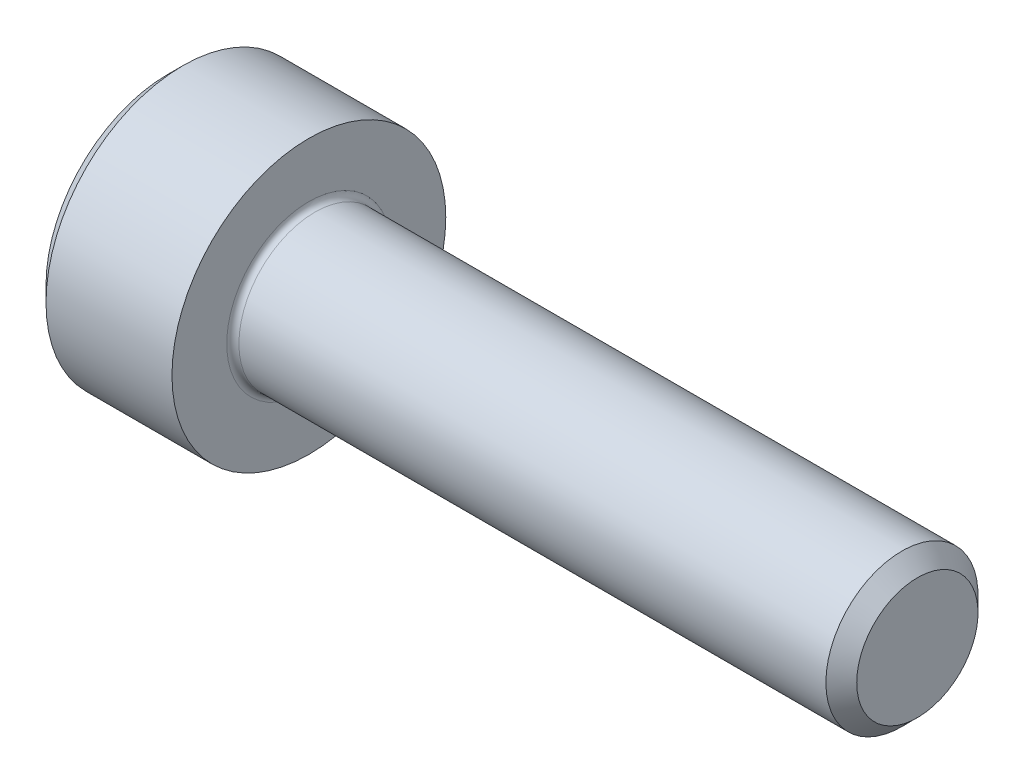
ISO-10303-21;
HEADER;
FILE_DESCRIPTION(('STEP AP214'),'2;1');
FILE_NAME('part.step','',(''),(''),'','','');
FILE_SCHEMA(('AUTOMOTIVE_DESIGN { 1 0 10303 214 1 1 1 1 }'));
ENDSEC;
DATA;
#1=APPLICATION_CONTEXT('core data for automotive mechanical design processes');
#2=APPLICATION_PROTOCOL_DEFINITION('international standard','automotive_design',2000,#1);
#3=PRODUCT_CONTEXT('',#1,'mechanical');
#4=PRODUCT('Part','Part','',(#3));
#5=PRODUCT_RELATED_PRODUCT_CATEGORY('part','',(#4));
#6=PRODUCT_DEFINITION_FORMATION('','',#4);
#7=PRODUCT_DEFINITION_CONTEXT('part definition',#1,'design');
#8=PRODUCT_DEFINITION('design','',#6,#7);
#9=PRODUCT_DEFINITION_SHAPE('','',#8);
#10=(LENGTH_UNIT() NAMED_UNIT(*) SI_UNIT(.MILLI.,.METRE.));
#11=(NAMED_UNIT(*) PLANE_ANGLE_UNIT() SI_UNIT($,.RADIAN.));
#12=(NAMED_UNIT(*) SI_UNIT($,.STERADIAN.) SOLID_ANGLE_UNIT());
#13=UNCERTAINTY_MEASURE_WITH_UNIT(LENGTH_MEASURE(1.E-05),#10,'distance_accuracy_value','');
#14=(GEOMETRIC_REPRESENTATION_CONTEXT(3) GLOBAL_UNCERTAINTY_ASSIGNED_CONTEXT((#13)) GLOBAL_UNIT_ASSIGNED_CONTEXT((#10,
#11,#12)) REPRESENTATION_CONTEXT('',''));
#15=CARTESIAN_POINT('',(0.,0.,0.));
#16=DIRECTION('',(0.,0.,1.));
#17=DIRECTION('',(1.,0.,0.));
#18=AXIS2_PLACEMENT_3D('',#15,#16,#17);
#19=CARTESIAN_POINT('',(0.,0.,0.));
#20=DIRECTION('',(-1.,0.,0.));
#21=DIRECTION('',(0.,0.,1.));
#22=AXIS2_PLACEMENT_3D('',#19,#20,#21);
#23=PLANE('',#22);
#24=DIRECTION('',(0.,-0.5,0.866025403784438));
#25=VECTOR('',#24,1.);
#26=CARTESIAN_POINT('',(0.,1.18068130049278,0.));
#27=LINE('',#26,#25);
#28=CARTESIAN_POINT('',(0.,1.18068130049278,0.));
#29=VERTEX_POINT('',#28);
#30=CARTESIAN_POINT('',(0.,0.59034065024639,1.0225));
#31=VERTEX_POINT('',#30);
#32=EDGE_CURVE('E390',#29,#31,#27,.T.);
#33=ORIENTED_EDGE('',*,*,#32,.T.);
#34=DIRECTION('',(0.,1.,0.));
#35=VECTOR('',#34,1.);
#36=CARTESIAN_POINT('',(0.,-0.590340650246395,1.0225));
#37=LINE('',#36,#35);
#38=CARTESIAN_POINT('',(0.,-0.590340650246395,1.0225));
#39=VERTEX_POINT('',#38);
#40=EDGE_CURVE('E132',#39,#31,#37,.T.);
#41=ORIENTED_EDGE('',*,*,#40,.F.);
#42=DIRECTION('',(0.,-0.500000000000001,-0.866025403784438));
#43=VECTOR('',#42,1.);
#44=CARTESIAN_POINT('',(0.,-0.590340650246395,1.0225));
#45=LINE('',#44,#43);
#46=CARTESIAN_POINT('',(0.,-1.18068130049279,0.));
#47=VERTEX_POINT('',#46);
#48=EDGE_CURVE('E393',#39,#47,#45,.T.);
#49=ORIENTED_EDGE('',*,*,#48,.T.);
#50=DIRECTION('',(0.,0.5,-0.866025403784439));
#51=VECTOR('',#50,1.);
#52=CARTESIAN_POINT('',(0.,-1.18068130049279,0.));
#53=LINE('',#52,#51);
#54=CARTESIAN_POINT('',(0.,-0.590340650246397,-1.0225));
#55=VERTEX_POINT('',#54);
#56=EDGE_CURVE('E396',#47,#55,#53,.T.);
#57=ORIENTED_EDGE('',*,*,#56,.T.);
#58=DIRECTION('',(0.,-1.,0.));
#59=VECTOR('',#58,1.);
#60=CARTESIAN_POINT('',(0.,0.590340650246389,-1.0225));
#61=LINE('',#60,#59);
#62=CARTESIAN_POINT('',(0.,0.590340650246389,-1.0225));
#63=VERTEX_POINT('',#62);
#64=EDGE_CURVE('E399',#63,#55,#61,.T.);
#65=ORIENTED_EDGE('',*,*,#64,.F.);
#66=DIRECTION('',(0.,-0.500000000000001,-0.866025403784438));
#67=VECTOR('',#66,1.);
#68=CARTESIAN_POINT('',(0.,1.18068130049278,0.));
#69=LINE('',#68,#67);
#70=EDGE_CURVE('E127',#29,#63,#69,.T.);
#71=ORIENTED_EDGE('',*,*,#70,.F.);
#72=EDGE_LOOP('',(#33,#41,#49,#57,#65,#71));
#73=FACE_BOUND('',#72,.T.);
#74=CARTESIAN_POINT('',(0.,0.,0.));
#75=DIRECTION('',(-1.,0.,0.));
#76=DIRECTION('',(0.,0.,1.));
#77=AXIS2_PLACEMENT_3D('',#74,#75,#76);
#78=CIRCLE('',#77,2.);
#79=CARTESIAN_POINT('',(0.,0.,2.));
#80=VERTEX_POINT('',#79);
#81=EDGE_CURVE('E143',#80,#80,#78,.T.);
#82=ORIENTED_EDGE('',*,*,#81,.T.);
#83=EDGE_LOOP('',(#82));
#84=FACE_BOUND('',#83,.T.);
#85=ADVANCED_FACE('F36',(#73,#84),#23,.T.);
#86=CARTESIAN_POINT('',(12.32,0.9965,0.));
#87=DIRECTION('',(1.,0.,0.));
#88=DIRECTION('',(0.,0.,-1.));
#89=AXIS2_PLACEMENT_3D('',#86,#87,#88);
#90=PLANE('',#89);
#91=CARTESIAN_POINT('',(12.32,0.,0.));
#92=DIRECTION('',(-1.,0.,0.));
#93=DIRECTION('',(0.,0.,1.));
#94=AXIS2_PLACEMENT_3D('',#91,#92,#93);
#95=CIRCLE('',#94,0.9965);
#96=CARTESIAN_POINT('',(12.32,0.,0.9965));
#97=VERTEX_POINT('',#96);
#98=EDGE_CURVE('E156',#97,#97,#95,.T.);
#99=ORIENTED_EDGE('',*,*,#98,.F.);
#100=EDGE_LOOP('',(#99));
#101=FACE_BOUND('',#100,.T.);
#102=ADVANCED_FACE('F177',(#101),#90,.T.);
#103=CARTESIAN_POINT('',(12.32,0.,0.));
#104=DIRECTION('',(-1.,0.,0.));
#105=DIRECTION('',(0.,0.,1.));
#106=AXIS2_PLACEMENT_3D('',#103,#104,#105);
#107=CONICAL_SURFACE('',#106,0.9965,0.785398163397328);
#108=CARTESIAN_POINT('',(12.0665,0.,0.));
#109=DIRECTION('',(-1.,0.,0.));
#110=DIRECTION('',(0.,0.,1.));
#111=AXIS2_PLACEMENT_3D('',#108,#109,#110);
#112=CIRCLE('',#111,1.24999999999996);
#113=CARTESIAN_POINT('',(12.0665,0.,1.24999999999996));
#114=VERTEX_POINT('',#113);
#115=EDGE_CURVE('E153',#114,#114,#112,.T.);
#116=ORIENTED_EDGE('',*,*,#115,.F.);
#117=EDGE_LOOP('',(#116));
#118=FACE_BOUND('',#117,.T.);
#119=ORIENTED_EDGE('',*,*,#98,.T.);
#120=EDGE_LOOP('',(#119));
#121=FACE_BOUND('',#120,.T.);
#122=ADVANCED_FACE('F183',(#118,#121),#107,.T.);
#123=CARTESIAN_POINT('',(-31.75,0.,0.));
#124=DIRECTION('',(-1.,0.,0.));
#125=DIRECTION('',(0.,0.,1.));
#126=AXIS2_PLACEMENT_3D('',#123,#124,#125);
#127=CYLINDRICAL_SURFACE('',#126,1.24999999999996);
#128=CARTESIAN_POINT('',(2.42,0.,0.));
#129=DIRECTION('',(1.,0.,0.));
#130=DIRECTION('',(0.,0.,-1.));
#131=AXIS2_PLACEMENT_3D('',#128,#129,#130);
#132=CIRCLE('',#131,1.24999999999996);
#133=CARTESIAN_POINT('',(2.42,0.,-1.24999999999996));
#134=VERTEX_POINT('',#133);
#135=EDGE_CURVE('E11',#134,#134,#132,.T.);
#136=ORIENTED_EDGE('',*,*,#135,.T.);
#137=EDGE_LOOP('',(#136));
#138=FACE_BOUND('',#137,.T.);
#139=ORIENTED_EDGE('',*,*,#115,.T.);
#140=EDGE_LOOP('',(#139));
#141=FACE_BOUND('',#140,.T.);
#142=ADVANCED_FACE('F194',(#138,#141),#127,.T.);
#143=CARTESIAN_POINT('',(2.32,2.25,0.));
#144=DIRECTION('',(1.,0.,0.));
#145=DIRECTION('',(0.,0.,-1.));
#146=AXIS2_PLACEMENT_3D('',#143,#144,#145);
#147=PLANE('',#146);
#148=CARTESIAN_POINT('',(2.32,0.,0.));
#149=DIRECTION('',(1.,0.,0.));
#150=DIRECTION('',(0.,0.,-1.));
#151=AXIS2_PLACEMENT_3D('',#148,#149,#150);
#152=CIRCLE('',#151,1.34999999999996);
#153=CARTESIAN_POINT('',(2.32,0.,-1.34999999999996));
#154=VERTEX_POINT('',#153);
#155=EDGE_CURVE('E44',#154,#154,#152,.F.);
#156=ORIENTED_EDGE('',*,*,#155,.T.);
#157=EDGE_LOOP('',(#156));
#158=FACE_BOUND('',#157,.T.);
#159=CARTESIAN_POINT('',(2.32,0.,0.));
#160=DIRECTION('',(-1.,0.,0.));
#161=DIRECTION('',(0.,0.,1.));
#162=AXIS2_PLACEMENT_3D('',#159,#160,#161);
#163=CIRCLE('',#162,2.25);
#164=CARTESIAN_POINT('',(2.32,0.,2.25));
#165=VERTEX_POINT('',#164);
#166=EDGE_CURVE('E150',#165,#165,#163,.T.);
#167=ORIENTED_EDGE('',*,*,#166,.F.);
#168=EDGE_LOOP('',(#167));
#169=FACE_BOUND('',#168,.T.);
#170=ADVANCED_FACE('F161',(#158,#169),#147,.T.);
#171=CARTESIAN_POINT('',(-31.75,0.,0.));
#172=DIRECTION('',(-1.,0.,0.));
#173=DIRECTION('',(0.,0.,1.));
#174=AXIS2_PLACEMENT_3D('',#171,#172,#173);
#175=CYLINDRICAL_SURFACE('',#174,2.25);
#176=ORIENTED_EDGE('',*,*,#166,.T.);
#177=EDGE_LOOP('',(#176));
#178=FACE_BOUND('',#177,.T.);
#179=CARTESIAN_POINT('',(0.25,0.,0.));
#180=DIRECTION('',(-1.,0.,0.));
#181=DIRECTION('',(0.,0.,1.));
#182=AXIS2_PLACEMENT_3D('',#179,#180,#181);
#183=CIRCLE('',#182,2.25);
#184=CARTESIAN_POINT('',(0.25,0.,2.25));
#185=VERTEX_POINT('',#184);
#186=EDGE_CURVE('E147',#185,#185,#183,.T.);
#187=ORIENTED_EDGE('',*,*,#186,.F.);
#188=EDGE_LOOP('',(#187));
#189=FACE_BOUND('',#188,.T.);
#190=ADVANCED_FACE('F172',(#178,#189),#175,.T.);
#191=CARTESIAN_POINT('',(0.,0.,0.));
#192=DIRECTION('',(1.,0.,0.));
#193=DIRECTION('',(0.,0.,-1.));
#194=AXIS2_PLACEMENT_3D('',#191,#192,#193);
#195=CONICAL_SURFACE('',#194,2.,0.785398163397448);
#196=ORIENTED_EDGE('',*,*,#186,.T.);
#197=EDGE_LOOP('',(#196));
#198=FACE_BOUND('',#197,.T.);
#199=ORIENTED_EDGE('',*,*,#81,.F.);
#200=EDGE_LOOP('',(#199));
#201=FACE_BOUND('',#200,.T.);
#202=ADVANCED_FACE('F165',(#198,#201),#195,.T.);
#203=CARTESIAN_POINT('',(2.42,0.,0.));
#204=DIRECTION('',(1.,0.,0.));
#205=DIRECTION('',(0.,0.,-1.));
#206=AXIS2_PLACEMENT_3D('',#203,#204,#205);
#207=TOROIDAL_SURFACE('',#206,1.34999999999996,0.1);
#208=ORIENTED_EDGE('',*,*,#135,.F.);
#209=EDGE_LOOP('',(#208));
#210=FACE_BOUND('',#209,.T.);
#211=ORIENTED_EDGE('',*,*,#155,.F.);
#212=EDGE_LOOP('',(#211));
#213=FACE_BOUND('',#212,.T.);
#214=ADVANCED_FACE('F38',(#210,#213),#207,.F.);
#215=CARTESIAN_POINT('',(1.1,1.18068130049278,0.));
#216=DIRECTION('',(0.,-0.866025403784439,-0.5));
#217=DIRECTION('',(0.,0.5,-0.866025403784438));
#218=AXIS2_PLACEMENT_3D('',#215,#216,#217);
#219=PLANE('',#218);
#220=ORIENTED_EDGE('',*,*,#32,.F.);
#221=DIRECTION('',(-1.,0.,0.));
#222=VECTOR('',#221,1.);
#223=CARTESIAN_POINT('',(1.1,1.18068130049278,0.));
#224=LINE('',#223,#222);
#225=CARTESIAN_POINT('',(1.1,1.18068130049278,0.));
#226=VERTEX_POINT('',#225);
#227=EDGE_CURVE('E380',#226,#29,#224,.T.);
#228=ORIENTED_EDGE('',*,*,#227,.F.);
#229=DIRECTION('',(0.,-0.5,0.866025403784438));
#230=VECTOR('',#229,1.);
#231=CARTESIAN_POINT('',(1.1,1.18068130049278,0.));
#232=LINE('',#231,#230);
#233=CARTESIAN_POINT('',(1.1,0.885510975369585,0.511249999999998));
#234=VERTEX_POINT('',#233);
#235=EDGE_CURVE('E119',#226,#234,#232,.T.);
#236=ORIENTED_EDGE('',*,*,#235,.T.);
#237=CARTESIAN_POINT('',(1.1,0.59034065024639,1.0225));
#238=VERTEX_POINT('',#237);
#239=EDGE_CURVE('E110',#234,#238,#232,.T.);
#240=ORIENTED_EDGE('',*,*,#239,.T.);
#241=DIRECTION('',(-1.,0.,0.));
#242=VECTOR('',#241,1.);
#243=CARTESIAN_POINT('',(1.1,0.59034065024639,1.0225));
#244=LINE('',#243,#242);
#245=EDGE_CURVE('E124',#238,#31,#244,.T.);
#246=ORIENTED_EDGE('',*,*,#245,.T.);
#247=EDGE_LOOP('',(#220,#228,#236,#240,#246));
#248=FACE_BOUND('',#247,.T.);
#249=ADVANCED_FACE('F123',(#248),#219,.T.);
#250=CARTESIAN_POINT('',(1.1,-0.590340650246395,1.0225));
#251=DIRECTION('',(0.,0.,1.));
#252=DIRECTION('',(0.,-1.,0.));
#253=AXIS2_PLACEMENT_3D('',#250,#251,#252);
#254=PLANE('',#253);
#255=ORIENTED_EDGE('',*,*,#40,.T.);
#256=ORIENTED_EDGE('',*,*,#245,.F.);
#257=DIRECTION('',(0.,1.,0.));
#258=VECTOR('',#257,1.);
#259=CARTESIAN_POINT('',(1.1,-0.590340650246395,1.0225));
#260=LINE('',#259,#258);
#261=CARTESIAN_POINT('',(1.1,0.,1.0225));
#262=VERTEX_POINT('',#261);
#263=EDGE_CURVE('E107',#262,#238,#260,.T.);
#264=ORIENTED_EDGE('',*,*,#263,.F.);
#265=CARTESIAN_POINT('',(1.1,-0.590340650246395,1.0225));
#266=VERTEX_POINT('',#265);
#267=EDGE_CURVE('E118',#266,#262,#260,.T.);
#268=ORIENTED_EDGE('',*,*,#267,.F.);
#269=DIRECTION('',(-1.,0.,0.));
#270=VECTOR('',#269,1.);
#271=CARTESIAN_POINT('',(1.1,-0.590340650246395,1.0225));
#272=LINE('',#271,#270);
#273=EDGE_CURVE('E134',#266,#39,#272,.T.);
#274=ORIENTED_EDGE('',*,*,#273,.T.);
#275=EDGE_LOOP('',(#255,#256,#264,#268,#274));
#276=FACE_BOUND('',#275,.T.);
#277=ADVANCED_FACE('F129',(#276),#254,.F.);
#278=CARTESIAN_POINT('',(1.1,-0.590340650246395,1.0225));
#279=DIRECTION('',(0.,0.866025403784438,-0.500000000000001));
#280=DIRECTION('',(0.,0.500000000000001,0.866025403784438));
#281=AXIS2_PLACEMENT_3D('',#278,#279,#280);
#282=PLANE('',#281);
#283=ORIENTED_EDGE('',*,*,#48,.F.);
#284=ORIENTED_EDGE('',*,*,#273,.F.);
#285=DIRECTION('',(0.,-0.500000000000001,-0.866025403784438));
#286=VECTOR('',#285,1.);
#287=CARTESIAN_POINT('',(1.1,-0.590340650246395,1.0225));
#288=LINE('',#287,#286);
#289=CARTESIAN_POINT('',(1.1,-0.88551097536959,0.511250000000002));
#290=VERTEX_POINT('',#289);
#291=EDGE_CURVE('E419',#266,#290,#288,.T.);
#292=ORIENTED_EDGE('',*,*,#291,.T.);
#293=CARTESIAN_POINT('',(1.1,-1.18068130049279,0.));
#294=VERTEX_POINT('',#293);
#295=EDGE_CURVE('E408',#290,#294,#288,.T.);
#296=ORIENTED_EDGE('',*,*,#295,.T.);
#297=DIRECTION('',(-1.,0.,0.));
#298=VECTOR('',#297,1.);
#299=CARTESIAN_POINT('',(1.1,-1.18068130049279,0.));
#300=LINE('',#299,#298);
#301=EDGE_CURVE('E139',#294,#47,#300,.T.);
#302=ORIENTED_EDGE('',*,*,#301,.T.);
#303=EDGE_LOOP('',(#283,#284,#292,#296,#302));
#304=FACE_BOUND('',#303,.T.);
#305=ADVANCED_FACE('F271',(#304),#282,.T.);
#306=CARTESIAN_POINT('',(1.1,-1.18068130049279,0.));
#307=DIRECTION('',(0.,0.866025403784439,0.5));
#308=DIRECTION('',(0.,-0.5,0.866025403784439));
#309=AXIS2_PLACEMENT_3D('',#306,#307,#308);
#310=PLANE('',#309);
#311=ORIENTED_EDGE('',*,*,#56,.F.);
#312=ORIENTED_EDGE('',*,*,#301,.F.);
#313=DIRECTION('',(0.,0.5,-0.866025403784439));
#314=VECTOR('',#313,1.);
#315=CARTESIAN_POINT('',(1.1,-1.18068130049279,0.));
#316=LINE('',#315,#314);
#317=CARTESIAN_POINT('',(1.1,-0.885510975369592,-0.511250000000002));
#318=VERTEX_POINT('',#317);
#319=EDGE_CURVE('E386',#294,#318,#316,.T.);
#320=ORIENTED_EDGE('',*,*,#319,.T.);
#321=CARTESIAN_POINT('',(1.1,-0.590340650246397,-1.0225));
#322=VERTEX_POINT('',#321);
#323=EDGE_CURVE('E418',#318,#322,#316,.T.);
#324=ORIENTED_EDGE('',*,*,#323,.T.);
#325=DIRECTION('',(-1.,0.,0.));
#326=VECTOR('',#325,1.);
#327=CARTESIAN_POINT('',(1.1,-0.590340650246397,-1.0225));
#328=LINE('',#327,#326);
#329=EDGE_CURVE('E379',#322,#55,#328,.T.);
#330=ORIENTED_EDGE('',*,*,#329,.T.);
#331=EDGE_LOOP('',(#311,#312,#320,#324,#330));
#332=FACE_BOUND('',#331,.T.);
#333=ADVANCED_FACE('F279',(#332),#310,.T.);
#334=CARTESIAN_POINT('',(1.1,0.590340650246389,-1.0225));
#335=DIRECTION('',(0.,0.,-1.));
#336=DIRECTION('',(0.,1.,0.));
#337=AXIS2_PLACEMENT_3D('',#334,#335,#336);
#338=PLANE('',#337);
#339=ORIENTED_EDGE('',*,*,#64,.T.);
#340=ORIENTED_EDGE('',*,*,#329,.F.);
#341=DIRECTION('',(0.,-1.,0.));
#342=VECTOR('',#341,1.);
#343=CARTESIAN_POINT('',(1.1,0.590340650246389,-1.0225));
#344=LINE('',#343,#342);
#345=CARTESIAN_POINT('',(1.1,0.,-1.0225));
#346=VERTEX_POINT('',#345);
#347=EDGE_CURVE('E383',#346,#322,#344,.T.);
#348=ORIENTED_EDGE('',*,*,#347,.F.);
#349=CARTESIAN_POINT('',(1.1,0.590340650246389,-1.0225));
#350=VERTEX_POINT('',#349);
#351=EDGE_CURVE('E51',#350,#346,#344,.T.);
#352=ORIENTED_EDGE('',*,*,#351,.F.);
#353=DIRECTION('',(-1.,0.,0.));
#354=VECTOR('',#353,1.);
#355=CARTESIAN_POINT('',(1.1,0.590340650246389,-1.0225));
#356=LINE('',#355,#354);
#357=EDGE_CURVE('E376',#350,#63,#356,.T.);
#358=ORIENTED_EDGE('',*,*,#357,.T.);
#359=EDGE_LOOP('',(#339,#340,#348,#352,#358));
#360=FACE_BOUND('',#359,.T.);
#361=ADVANCED_FACE('F288',(#360),#338,.F.);
#362=CARTESIAN_POINT('',(1.1,1.18068130049278,0.));
#363=DIRECTION('',(0.,0.866025403784438,-0.500000000000001));
#364=DIRECTION('',(0.,0.500000000000001,0.866025403784438));
#365=AXIS2_PLACEMENT_3D('',#362,#363,#364);
#366=PLANE('',#365);
#367=ORIENTED_EDGE('',*,*,#70,.T.);
#368=ORIENTED_EDGE('',*,*,#357,.F.);
#369=DIRECTION('',(0.,-0.500000000000001,-0.866025403784438));
#370=VECTOR('',#369,1.);
#371=CARTESIAN_POINT('',(1.1,1.18068130049278,0.));
#372=LINE('',#371,#370);
#373=CARTESIAN_POINT('',(1.1,0.885510975369587,-0.511250000000001));
#374=VERTEX_POINT('',#373);
#375=EDGE_CURVE('E366',#374,#350,#372,.T.);
#376=ORIENTED_EDGE('',*,*,#375,.F.);
#377=EDGE_CURVE('E372',#226,#374,#372,.T.);
#378=ORIENTED_EDGE('',*,*,#377,.F.);
#379=ORIENTED_EDGE('',*,*,#227,.T.);
#380=EDGE_LOOP('',(#367,#368,#376,#378,#379));
#381=FACE_BOUND('',#380,.T.);
#382=ADVANCED_FACE('F297',(#381),#366,.F.);
#383=CARTESIAN_POINT('',(1.1,1.18068130049278,0.));
#384=DIRECTION('',(1.,0.,0.));
#385=DIRECTION('',(0.,0.,-1.));
#386=AXIS2_PLACEMENT_3D('',#383,#384,#385);
#387=PLANE('',#386);
#388=ORIENTED_EDGE('',*,*,#347,.T.);
#389=ORIENTED_EDGE('',*,*,#323,.F.);
#390=CARTESIAN_POINT('',(1.1,0.,0.));
#391=DIRECTION('',(-1.,0.,0.));
#392=DIRECTION('',(0.,0.,1.));
#393=AXIS2_PLACEMENT_3D('',#390,#391,#392);
#394=CIRCLE('',#393,1.0225);
#395=EDGE_CURVE('E414',#346,#318,#394,.T.);
#396=ORIENTED_EDGE('',*,*,#395,.F.);
#397=EDGE_LOOP('',(#388,#389,#396));
#398=FACE_BOUND('',#397,.T.);
#399=ADVANCED_FACE('F306',(#398),#387,.F.);
#400=ORIENTED_EDGE('',*,*,#319,.F.);
#401=ORIENTED_EDGE('',*,*,#295,.F.);
#402=EDGE_CURVE('E137',#318,#290,#394,.T.);
#403=ORIENTED_EDGE('',*,*,#402,.F.);
#404=EDGE_LOOP('',(#400,#401,#403));
#405=FACE_BOUND('',#404,.T.);
#406=ADVANCED_FACE('F315',(#405),#387,.F.);
#407=ORIENTED_EDGE('',*,*,#291,.F.);
#408=ORIENTED_EDGE('',*,*,#267,.T.);
#409=EDGE_CURVE('E133',#290,#262,#394,.T.);
#410=ORIENTED_EDGE('',*,*,#409,.F.);
#411=EDGE_LOOP('',(#407,#408,#410));
#412=FACE_BOUND('',#411,.T.);
#413=ADVANCED_FACE('F324',(#412),#387,.F.);
#414=ORIENTED_EDGE('',*,*,#263,.T.);
#415=ORIENTED_EDGE('',*,*,#239,.F.);
#416=EDGE_CURVE('E113',#262,#234,#394,.T.);
#417=ORIENTED_EDGE('',*,*,#416,.F.);
#418=EDGE_LOOP('',(#414,#415,#417));
#419=FACE_BOUND('',#418,.T.);
#420=ADVANCED_FACE('F109',(#419),#387,.F.);
#421=ORIENTED_EDGE('',*,*,#235,.F.);
#422=ORIENTED_EDGE('',*,*,#377,.T.);
#423=EDGE_CURVE('E144',#234,#374,#394,.T.);
#424=ORIENTED_EDGE('',*,*,#423,.F.);
#425=EDGE_LOOP('',(#421,#422,#424));
#426=FACE_BOUND('',#425,.T.);
#427=ADVANCED_FACE('F339',(#426),#387,.F.);
#428=ORIENTED_EDGE('',*,*,#375,.T.);
#429=ORIENTED_EDGE('',*,*,#351,.T.);
#430=EDGE_CURVE('E369',#374,#346,#394,.T.);
#431=ORIENTED_EDGE('',*,*,#430,.F.);
#432=EDGE_LOOP('',(#428,#429,#431));
#433=FACE_BOUND('',#432,.T.);
#434=ADVANCED_FACE('F254',(#433),#387,.F.);
#435=CARTESIAN_POINT('',(1.1,0.,0.));
#436=DIRECTION('',(-1.,0.,0.));
#437=DIRECTION('',(0.,0.,1.));
#438=AXIS2_PLACEMENT_3D('',#435,#436,#437);
#439=CONICAL_SURFACE('',#438,1.0225,1.04719755119659);
#440=CARTESIAN_POINT('',(1.6903406502464,0.,0.));
#441=VERTEX_POINT('',#440);
#442=VERTEX_LOOP('',#441);
#443=FACE_BOUND('',#442,.T.);
#444=ORIENTED_EDGE('',*,*,#416,.T.);
#445=ORIENTED_EDGE('',*,*,#423,.T.);
#446=ORIENTED_EDGE('',*,*,#430,.T.);
#447=ORIENTED_EDGE('',*,*,#395,.T.);
#448=ORIENTED_EDGE('',*,*,#402,.T.);
#449=ORIENTED_EDGE('',*,*,#409,.T.);
#450=EDGE_LOOP('',(#444,#445,#446,#447,#448,#449));
#451=FACE_BOUND('',#450,.T.);
#452=ADVANCED_FACE('F187',(#443,#451),#439,.F.);
#453=CLOSED_SHELL('',(#85,#102,#122,#142,#170,#190,#202,#214,#249,#277,#305,#333,#361,#382,#399,
#406,#413,#420,#427,#434,#452));
#454=MANIFOLD_SOLID_BREP('B2',#453);
#455=ADVANCED_BREP_SHAPE_REPRESENTATION('',(#18,#454),#14);
#456=SHAPE_DEFINITION_REPRESENTATION(#9,#455);
ENDSEC;
END-ISO-10303-21;
